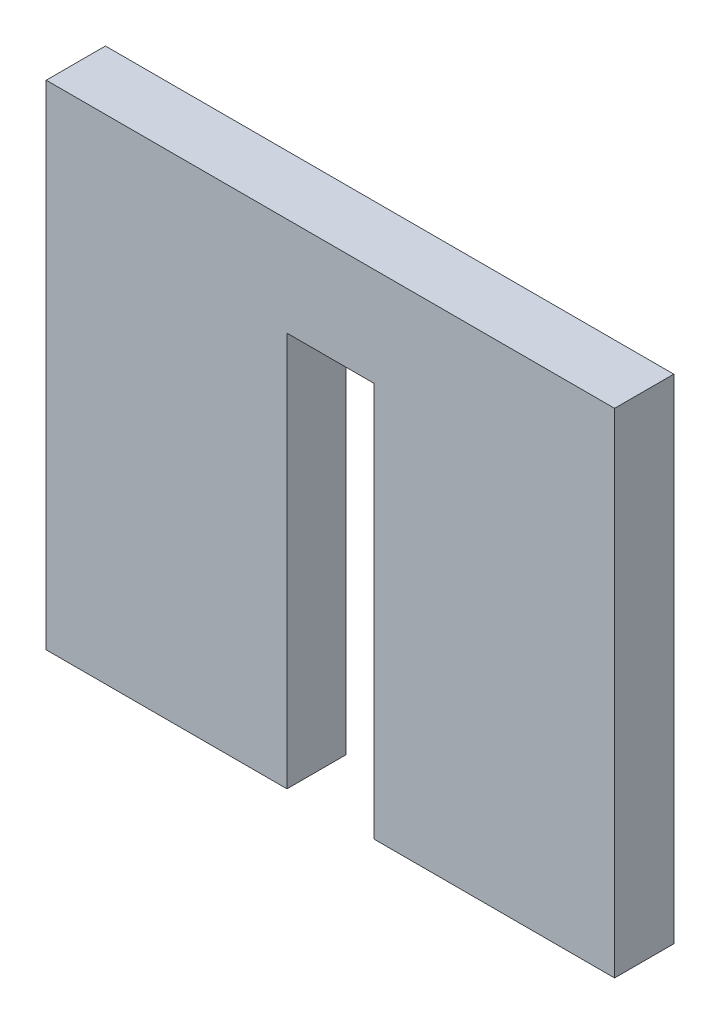
ISO-10303-21;
HEADER;
FILE_DESCRIPTION(('STEP AP214'),'2;1');
FILE_NAME('part.step','',(''),(''),'','','');
FILE_SCHEMA(('AUTOMOTIVE_DESIGN { 1 0 10303 214 1 1 1 1 }'));
ENDSEC;
DATA;
#1=APPLICATION_CONTEXT('core data for automotive mechanical design processes');
#2=APPLICATION_PROTOCOL_DEFINITION('international standard','automotive_design',2000,#1);
#3=PRODUCT_CONTEXT('',#1,'mechanical');
#4=PRODUCT('Part','Part','',(#3));
#5=PRODUCT_RELATED_PRODUCT_CATEGORY('part','',(#4));
#6=PRODUCT_DEFINITION_FORMATION('','',#4);
#7=PRODUCT_DEFINITION_CONTEXT('part definition',#1,'design');
#8=PRODUCT_DEFINITION('design','',#6,#7);
#9=PRODUCT_DEFINITION_SHAPE('','',#8);
#10=(LENGTH_UNIT() NAMED_UNIT(*) SI_UNIT(.MILLI.,.METRE.));
#11=(NAMED_UNIT(*) PLANE_ANGLE_UNIT() SI_UNIT($,.RADIAN.));
#12=(NAMED_UNIT(*) SI_UNIT($,.STERADIAN.) SOLID_ANGLE_UNIT());
#13=UNCERTAINTY_MEASURE_WITH_UNIT(LENGTH_MEASURE(1.E-05),#10,'distance_accuracy_value','');
#14=(GEOMETRIC_REPRESENTATION_CONTEXT(3) GLOBAL_UNCERTAINTY_ASSIGNED_CONTEXT((#13)) GLOBAL_UNIT_ASSIGNED_CONTEXT((#10,
#11,#12)) REPRESENTATION_CONTEXT('',''));
#15=CARTESIAN_POINT('',(0.,0.,0.));
#16=DIRECTION('',(0.,0.,1.));
#17=DIRECTION('',(1.,0.,0.));
#18=AXIS2_PLACEMENT_3D('',#15,#16,#17);
#19=CARTESIAN_POINT('',(12.2,0.,3.));
#20=DIRECTION('',(0.,1.,0.));
#21=DIRECTION('',(0.,0.,1.));
#22=AXIS2_PLACEMENT_3D('',#19,#20,#21);
#23=PLANE('',#22);
#24=DIRECTION('',(1.,0.,0.));
#25=VECTOR('',#24,1.);
#26=CARTESIAN_POINT('',(12.2,0.,0.));
#27=LINE('',#26,#25);
#28=CARTESIAN_POINT('',(0.,0.,0.));
#29=VERTEX_POINT('',#28);
#30=CARTESIAN_POINT('',(12.2,0.,0.));
#31=VERTEX_POINT('',#30);
#32=EDGE_CURVE('E128',#29,#31,#27,.T.);
#33=ORIENTED_EDGE('',*,*,#32,.T.);
#34=DIRECTION('',(0.,0.,-1.));
#35=VECTOR('',#34,1.);
#36=CARTESIAN_POINT('',(12.2,0.,3.));
#37=LINE('',#36,#35);
#38=CARTESIAN_POINT('',(12.2,0.,3.));
#39=VERTEX_POINT('',#38);
#40=EDGE_CURVE('E11',#39,#31,#37,.T.);
#41=ORIENTED_EDGE('',*,*,#40,.F.);
#42=DIRECTION('',(1.,0.,0.));
#43=VECTOR('',#42,1.);
#44=CARTESIAN_POINT('',(12.2,0.,3.));
#45=LINE('',#44,#43);
#46=CARTESIAN_POINT('',(0.,0.,3.));
#47=VERTEX_POINT('',#46);
#48=EDGE_CURVE('E142',#47,#39,#45,.T.);
#49=ORIENTED_EDGE('',*,*,#48,.F.);
#50=DIRECTION('',(0.,0.,-1.));
#51=VECTOR('',#50,1.);
#52=CARTESIAN_POINT('',(0.,0.,3.));
#53=LINE('',#52,#51);
#54=EDGE_CURVE('E124',#47,#29,#53,.T.);
#55=ORIENTED_EDGE('',*,*,#54,.T.);
#56=EDGE_LOOP('',(#33,#41,#49,#55));
#57=FACE_BOUND('',#56,.T.);
#58=ADVANCED_FACE('F32',(#57),#23,.F.);
#59=CARTESIAN_POINT('',(12.2,20.,3.));
#60=DIRECTION('',(-1.,0.,0.));
#61=DIRECTION('',(0.,-1.,0.));
#62=AXIS2_PLACEMENT_3D('',#59,#60,#61);
#63=PLANE('',#62);
#64=DIRECTION('',(0.,1.,0.));
#65=VECTOR('',#64,1.);
#66=CARTESIAN_POINT('',(12.2,20.,0.));
#67=LINE('',#66,#65);
#68=CARTESIAN_POINT('',(12.2,20.,0.));
#69=VERTEX_POINT('',#68);
#70=EDGE_CURVE('E131',#31,#69,#67,.T.);
#71=ORIENTED_EDGE('',*,*,#70,.T.);
#72=DIRECTION('',(0.,0.,-1.));
#73=VECTOR('',#72,1.);
#74=CARTESIAN_POINT('',(12.2,20.,3.));
#75=LINE('',#74,#73);
#76=CARTESIAN_POINT('',(12.2,20.,3.));
#77=VERTEX_POINT('',#76);
#78=EDGE_CURVE('E40',#77,#69,#75,.T.);
#79=ORIENTED_EDGE('',*,*,#78,.F.);
#80=DIRECTION('',(0.,1.,0.));
#81=VECTOR('',#80,1.);
#82=CARTESIAN_POINT('',(12.2,20.,3.));
#83=LINE('',#82,#81);
#84=EDGE_CURVE('E91',#39,#77,#83,.T.);
#85=ORIENTED_EDGE('',*,*,#84,.F.);
#86=ORIENTED_EDGE('',*,*,#40,.T.);
#87=EDGE_LOOP('',(#71,#79,#85,#86));
#88=FACE_BOUND('',#87,.T.);
#89=ADVANCED_FACE('F177',(#88),#63,.F.);
#90=CARTESIAN_POINT('',(16.6,20.,3.));
#91=DIRECTION('',(0.,1.,0.));
#92=DIRECTION('',(-1.,0.,0.));
#93=AXIS2_PLACEMENT_3D('',#90,#91,#92);
#94=PLANE('',#93);
#95=DIRECTION('',(1.,0.,0.));
#96=VECTOR('',#95,1.);
#97=CARTESIAN_POINT('',(16.6,20.,0.));
#98=LINE('',#97,#96);
#99=CARTESIAN_POINT('',(16.6,20.,0.));
#100=VERTEX_POINT('',#99);
#101=EDGE_CURVE('E133',#69,#100,#98,.T.);
#102=ORIENTED_EDGE('',*,*,#101,.T.);
#103=DIRECTION('',(0.,0.,-1.));
#104=VECTOR('',#103,1.);
#105=CARTESIAN_POINT('',(16.6,20.,3.));
#106=LINE('',#105,#104);
#107=CARTESIAN_POINT('',(16.6,20.,3.));
#108=VERTEX_POINT('',#107);
#109=EDGE_CURVE('E149',#108,#100,#106,.T.);
#110=ORIENTED_EDGE('',*,*,#109,.F.);
#111=DIRECTION('',(1.,0.,0.));
#112=VECTOR('',#111,1.);
#113=CARTESIAN_POINT('',(16.6,20.,3.));
#114=LINE('',#113,#112);
#115=EDGE_CURVE('E157',#77,#108,#114,.T.);
#116=ORIENTED_EDGE('',*,*,#115,.F.);
#117=ORIENTED_EDGE('',*,*,#78,.T.);
#118=EDGE_LOOP('',(#102,#110,#116,#117));
#119=FACE_BOUND('',#118,.T.);
#120=ADVANCED_FACE('F155',(#119),#94,.F.);
#121=CARTESIAN_POINT('',(16.6,0.,3.));
#122=DIRECTION('',(1.,0.,0.));
#123=DIRECTION('',(0.,0.,-1.));
#124=AXIS2_PLACEMENT_3D('',#121,#122,#123);
#125=PLANE('',#124);
#126=DIRECTION('',(0.,-1.,0.));
#127=VECTOR('',#126,1.);
#128=CARTESIAN_POINT('',(16.6,0.,0.));
#129=LINE('',#128,#127);
#130=CARTESIAN_POINT('',(16.6,0.,0.));
#131=VERTEX_POINT('',#130);
#132=EDGE_CURVE('E135',#100,#131,#129,.T.);
#133=ORIENTED_EDGE('',*,*,#132,.T.);
#134=DIRECTION('',(0.,0.,-1.));
#135=VECTOR('',#134,1.);
#136=CARTESIAN_POINT('',(16.6,0.,3.));
#137=LINE('',#136,#135);
#138=CARTESIAN_POINT('',(16.6,0.,3.));
#139=VERTEX_POINT('',#138);
#140=EDGE_CURVE('E146',#139,#131,#137,.T.);
#141=ORIENTED_EDGE('',*,*,#140,.F.);
#142=DIRECTION('',(0.,-1.,0.));
#143=VECTOR('',#142,1.);
#144=CARTESIAN_POINT('',(16.6,0.,3.));
#145=LINE('',#144,#143);
#146=EDGE_CURVE('E169',#108,#139,#145,.T.);
#147=ORIENTED_EDGE('',*,*,#146,.F.);
#148=ORIENTED_EDGE('',*,*,#109,.T.);
#149=EDGE_LOOP('',(#133,#141,#147,#148));
#150=FACE_BOUND('',#149,.T.);
#151=ADVANCED_FACE('F165',(#150),#125,.F.);
#152=CARTESIAN_POINT('',(28.8,0.,3.));
#153=DIRECTION('',(0.,1.,0.));
#154=DIRECTION('',(-1.,0.,0.));
#155=AXIS2_PLACEMENT_3D('',#152,#153,#154);
#156=PLANE('',#155);
#157=DIRECTION('',(1.,0.,0.));
#158=VECTOR('',#157,1.);
#159=CARTESIAN_POINT('',(28.8,0.,0.));
#160=LINE('',#159,#158);
#161=CARTESIAN_POINT('',(28.8,0.,0.));
#162=VERTEX_POINT('',#161);
#163=EDGE_CURVE('E137',#131,#162,#160,.T.);
#164=ORIENTED_EDGE('',*,*,#163,.T.);
#165=DIRECTION('',(0.,0.,-1.));
#166=VECTOR('',#165,1.);
#167=CARTESIAN_POINT('',(28.8,0.,3.));
#168=LINE('',#167,#166);
#169=CARTESIAN_POINT('',(28.8,0.,3.));
#170=VERTEX_POINT('',#169);
#171=EDGE_CURVE('E119',#170,#162,#168,.T.);
#172=ORIENTED_EDGE('',*,*,#171,.F.);
#173=DIRECTION('',(1.,0.,0.));
#174=VECTOR('',#173,1.);
#175=CARTESIAN_POINT('',(28.8,0.,3.));
#176=LINE('',#175,#174);
#177=EDGE_CURVE('E110',#139,#170,#176,.T.);
#178=ORIENTED_EDGE('',*,*,#177,.F.);
#179=ORIENTED_EDGE('',*,*,#140,.T.);
#180=EDGE_LOOP('',(#164,#172,#178,#179));
#181=FACE_BOUND('',#180,.T.);
#182=ADVANCED_FACE('F168',(#181),#156,.F.);
#183=CARTESIAN_POINT('',(28.8,25.,3.));
#184=DIRECTION('',(-1.,0.,0.));
#185=DIRECTION('',(0.,-1.,0.));
#186=AXIS2_PLACEMENT_3D('',#183,#184,#185);
#187=PLANE('',#186);
#188=DIRECTION('',(0.,1.,0.));
#189=VECTOR('',#188,1.);
#190=CARTESIAN_POINT('',(28.8,25.,0.));
#191=LINE('',#190,#189);
#192=CARTESIAN_POINT('',(28.8,25.,0.));
#193=VERTEX_POINT('',#192);
#194=EDGE_CURVE('E118',#162,#193,#191,.T.);
#195=ORIENTED_EDGE('',*,*,#194,.T.);
#196=DIRECTION('',(0.,0.,-1.));
#197=VECTOR('',#196,1.);
#198=CARTESIAN_POINT('',(28.8,25.,3.));
#199=LINE('',#198,#197);
#200=CARTESIAN_POINT('',(28.8,25.,3.));
#201=VERTEX_POINT('',#200);
#202=EDGE_CURVE('E115',#201,#193,#199,.T.);
#203=ORIENTED_EDGE('',*,*,#202,.F.);
#204=DIRECTION('',(0.,1.,0.));
#205=VECTOR('',#204,1.);
#206=CARTESIAN_POINT('',(28.8,25.,3.));
#207=LINE('',#206,#205);
#208=EDGE_CURVE('E104',#170,#201,#207,.T.);
#209=ORIENTED_EDGE('',*,*,#208,.F.);
#210=ORIENTED_EDGE('',*,*,#171,.T.);
#211=EDGE_LOOP('',(#195,#203,#209,#210));
#212=FACE_BOUND('',#211,.T.);
#213=ADVANCED_FACE('F116',(#212),#187,.F.);
#214=CARTESIAN_POINT('',(0.,25.,3.));
#215=DIRECTION('',(0.,-1.,0.));
#216=DIRECTION('',(0.,0.,-1.));
#217=AXIS2_PLACEMENT_3D('',#214,#215,#216);
#218=PLANE('',#217);
#219=DIRECTION('',(-1.,0.,0.));
#220=VECTOR('',#219,1.);
#221=CARTESIAN_POINT('',(0.,25.,0.));
#222=LINE('',#221,#220);
#223=CARTESIAN_POINT('',(0.,25.,0.));
#224=VERTEX_POINT('',#223);
#225=EDGE_CURVE('E77',#193,#224,#222,.T.);
#226=ORIENTED_EDGE('',*,*,#225,.T.);
#227=DIRECTION('',(0.,0.,-1.));
#228=VECTOR('',#227,1.);
#229=CARTESIAN_POINT('',(0.,25.,3.));
#230=LINE('',#229,#228);
#231=CARTESIAN_POINT('',(0.,25.,3.));
#232=VERTEX_POINT('',#231);
#233=EDGE_CURVE('E120',#232,#224,#230,.T.);
#234=ORIENTED_EDGE('',*,*,#233,.F.);
#235=DIRECTION('',(-1.,0.,0.));
#236=VECTOR('',#235,1.);
#237=CARTESIAN_POINT('',(0.,25.,3.));
#238=LINE('',#237,#236);
#239=EDGE_CURVE('E108',#201,#232,#238,.T.);
#240=ORIENTED_EDGE('',*,*,#239,.F.);
#241=ORIENTED_EDGE('',*,*,#202,.T.);
#242=EDGE_LOOP('',(#226,#234,#240,#241));
#243=FACE_BOUND('',#242,.T.);
#244=ADVANCED_FACE('F122',(#243),#218,.F.);
#245=CARTESIAN_POINT('',(0.,0.,3.));
#246=DIRECTION('',(1.,0.,0.));
#247=DIRECTION('',(0.,0.,-1.));
#248=AXIS2_PLACEMENT_3D('',#245,#246,#247);
#249=PLANE('',#248);
#250=DIRECTION('',(0.,-1.,0.));
#251=VECTOR('',#250,1.);
#252=CARTESIAN_POINT('',(0.,0.,0.));
#253=LINE('',#252,#251);
#254=EDGE_CURVE('E83',#224,#29,#253,.T.);
#255=ORIENTED_EDGE('',*,*,#254,.T.);
#256=ORIENTED_EDGE('',*,*,#54,.F.);
#257=DIRECTION('',(0.,-1.,0.));
#258=VECTOR('',#257,1.);
#259=CARTESIAN_POINT('',(0.,0.,3.));
#260=LINE('',#259,#258);
#261=EDGE_CURVE('E48',#232,#47,#260,.T.);
#262=ORIENTED_EDGE('',*,*,#261,.F.);
#263=ORIENTED_EDGE('',*,*,#233,.T.);
#264=EDGE_LOOP('',(#255,#256,#262,#263));
#265=FACE_BOUND('',#264,.T.);
#266=ADVANCED_FACE('F193',(#265),#249,.F.);
#267=CARTESIAN_POINT('',(0.,0.,3.));
#268=DIRECTION('',(0.,0.,-1.));
#269=DIRECTION('',(-1.,0.,0.));
#270=AXIS2_PLACEMENT_3D('',#267,#268,#269);
#271=PLANE('',#270);
#272=ORIENTED_EDGE('',*,*,#48,.T.);
#273=ORIENTED_EDGE('',*,*,#84,.T.);
#274=ORIENTED_EDGE('',*,*,#115,.T.);
#275=ORIENTED_EDGE('',*,*,#146,.T.);
#276=ORIENTED_EDGE('',*,*,#177,.T.);
#277=ORIENTED_EDGE('',*,*,#208,.T.);
#278=ORIENTED_EDGE('',*,*,#239,.T.);
#279=ORIENTED_EDGE('',*,*,#261,.T.);
#280=EDGE_LOOP('',(#272,#273,#274,#275,#276,#277,#278,#279));
#281=FACE_BOUND('',#280,.T.);
#282=ADVANCED_FACE('F106',(#281),#271,.F.);
#283=CARTESIAN_POINT('',(0.,0.,0.));
#284=DIRECTION('',(0.,0.,-1.));
#285=DIRECTION('',(-1.,0.,0.));
#286=AXIS2_PLACEMENT_3D('',#283,#284,#285);
#287=PLANE('',#286);
#288=ORIENTED_EDGE('',*,*,#32,.F.);
#289=ORIENTED_EDGE('',*,*,#254,.F.);
#290=ORIENTED_EDGE('',*,*,#225,.F.);
#291=ORIENTED_EDGE('',*,*,#194,.F.);
#292=ORIENTED_EDGE('',*,*,#163,.F.);
#293=ORIENTED_EDGE('',*,*,#132,.F.);
#294=ORIENTED_EDGE('',*,*,#101,.F.);
#295=ORIENTED_EDGE('',*,*,#70,.F.);
#296=EDGE_LOOP('',(#288,#289,#290,#291,#292,#293,#294,#295));
#297=FACE_BOUND('',#296,.T.);
#298=ADVANCED_FACE('F161',(#297),#287,.T.);
#299=CLOSED_SHELL('',(#58,#89,#120,#151,#182,#213,#244,#266,#282,#298));
#300=MANIFOLD_SOLID_BREP('B2',#299);
#301=ADVANCED_BREP_SHAPE_REPRESENTATION('',(#18,#300),#14);
#302=SHAPE_DEFINITION_REPRESENTATION(#9,#301);
ENDSEC;
END-ISO-10303-21;
